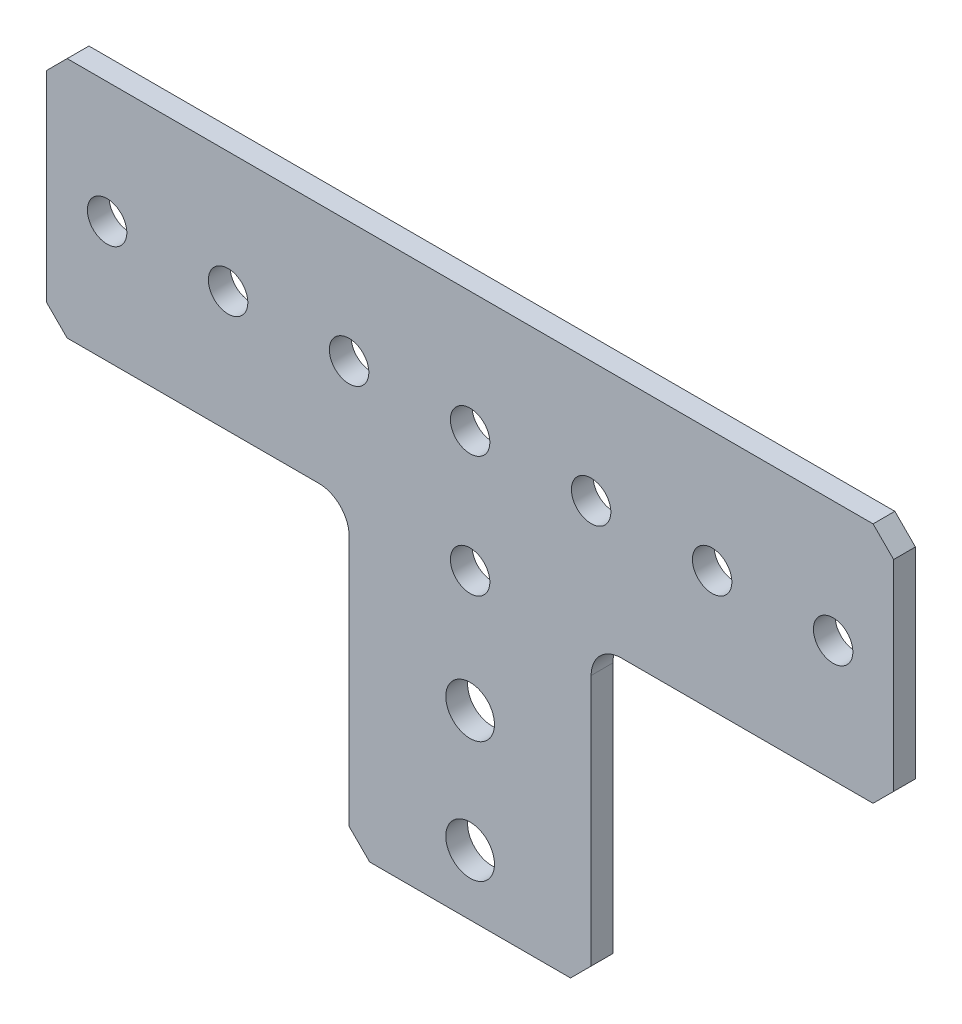
ISO-10303-21;
HEADER;
FILE_DESCRIPTION(('STEP AP214'),'2;1');
FILE_NAME('part.step','',(''),(''),'','','');
FILE_SCHEMA(('AUTOMOTIVE_DESIGN { 1 0 10303 214 1 1 1 1 }'));
ENDSEC;
DATA;
#1=APPLICATION_CONTEXT('core data for automotive mechanical design processes');
#2=APPLICATION_PROTOCOL_DEFINITION('international standard','automotive_design',2000,#1);
#3=PRODUCT_CONTEXT('',#1,'mechanical');
#4=PRODUCT('Part','Part','',(#3));
#5=PRODUCT_RELATED_PRODUCT_CATEGORY('part','',(#4));
#6=PRODUCT_DEFINITION_FORMATION('','',#4);
#7=PRODUCT_DEFINITION_CONTEXT('part definition',#1,'design');
#8=PRODUCT_DEFINITION('design','',#6,#7);
#9=PRODUCT_DEFINITION_SHAPE('','',#8);
#10=(LENGTH_UNIT() NAMED_UNIT(*) SI_UNIT(.MILLI.,.METRE.));
#11=(NAMED_UNIT(*) PLANE_ANGLE_UNIT() SI_UNIT($,.RADIAN.));
#12=(NAMED_UNIT(*) SI_UNIT($,.STERADIAN.) SOLID_ANGLE_UNIT());
#13=UNCERTAINTY_MEASURE_WITH_UNIT(LENGTH_MEASURE(1.E-05),#10,'distance_accuracy_value','');
#14=(GEOMETRIC_REPRESENTATION_CONTEXT(3) GLOBAL_UNCERTAINTY_ASSIGNED_CONTEXT((#13)) GLOBAL_UNIT_ASSIGNED_CONTEXT((#10,
#11,#12)) REPRESENTATION_CONTEXT('',''));
#15=CARTESIAN_POINT('',(0.,0.,0.));
#16=DIRECTION('',(0.,0.,1.));
#17=DIRECTION('',(1.,0.,0.));
#18=AXIS2_PLACEMENT_3D('',#15,#16,#17);
#19=CARTESIAN_POINT('',(-44.45,0.,0.));
#20=DIRECTION('',(0.,0.,1.));
#21=DIRECTION('',(1.,0.,0.));
#22=AXIS2_PLACEMENT_3D('',#19,#20,#21);
#23=PLANE('',#22);
#24=CARTESIAN_POINT('',(38.1,12.7,0.));
#25=DIRECTION('',(0.,0.,-1.));
#26=DIRECTION('',(-1.,0.,0.));
#27=AXIS2_PLACEMENT_3D('',#24,#25,#26);
#28=CIRCLE('',#27,2.0701);
#29=CARTESIAN_POINT('',(36.0299,12.7,0.));
#30=VERTEX_POINT('',#29);
#31=EDGE_CURVE('E281',#30,#30,#28,.F.);
#32=ORIENTED_EDGE('',*,*,#31,.T.);
#33=EDGE_LOOP('',(#32));
#34=FACE_BOUND('',#33,.T.);
#35=CARTESIAN_POINT('',(12.7,12.7,0.));
#36=DIRECTION('',(0.,0.,-1.));
#37=DIRECTION('',(-1.,0.,0.));
#38=AXIS2_PLACEMENT_3D('',#35,#36,#37);
#39=CIRCLE('',#38,2.0701);
#40=CARTESIAN_POINT('',(10.6299,12.7,0.));
#41=VERTEX_POINT('',#40);
#42=EDGE_CURVE('E284',#41,#41,#39,.F.);
#43=ORIENTED_EDGE('',*,*,#42,.T.);
#44=EDGE_LOOP('',(#43));
#45=FACE_BOUND('',#44,.T.);
#46=CARTESIAN_POINT('',(-12.7,12.7,0.));
#47=DIRECTION('',(0.,0.,-1.));
#48=DIRECTION('',(-1.,0.,0.));
#49=AXIS2_PLACEMENT_3D('',#46,#47,#48);
#50=CIRCLE('',#49,2.0701);
#51=CARTESIAN_POINT('',(-14.7701,12.7,0.));
#52=VERTEX_POINT('',#51);
#53=EDGE_CURVE('E287',#52,#52,#50,.F.);
#54=ORIENTED_EDGE('',*,*,#53,.T.);
#55=EDGE_LOOP('',(#54));
#56=FACE_BOUND('',#55,.T.);
#57=CARTESIAN_POINT('',(-25.4,12.7,0.));
#58=DIRECTION('',(0.,0.,-1.));
#59=DIRECTION('',(-1.,0.,0.));
#60=AXIS2_PLACEMENT_3D('',#57,#58,#59);
#61=CIRCLE('',#60,2.0701);
#62=CARTESIAN_POINT('',(-27.4701,12.7,0.));
#63=VERTEX_POINT('',#62);
#64=EDGE_CURVE('E290',#63,#63,#61,.F.);
#65=ORIENTED_EDGE('',*,*,#64,.T.);
#66=EDGE_LOOP('',(#65));
#67=FACE_BOUND('',#66,.T.);
#68=CARTESIAN_POINT('',(-38.1,12.7,0.));
#69=DIRECTION('',(0.,0.,-1.));
#70=DIRECTION('',(-1.,0.,0.));
#71=AXIS2_PLACEMENT_3D('',#68,#69,#70);
#72=CIRCLE('',#71,2.0701);
#73=CARTESIAN_POINT('',(-40.1701,12.7,0.));
#74=VERTEX_POINT('',#73);
#75=EDGE_CURVE('E293',#74,#74,#72,.F.);
#76=ORIENTED_EDGE('',*,*,#75,.T.);
#77=EDGE_LOOP('',(#76));
#78=FACE_BOUND('',#77,.T.);
#79=CARTESIAN_POINT('',(0.,12.7,0.));
#80=DIRECTION('',(0.,0.,-1.));
#81=DIRECTION('',(-1.,0.,0.));
#82=AXIS2_PLACEMENT_3D('',#79,#80,#81);
#83=CIRCLE('',#82,2.0701);
#84=CARTESIAN_POINT('',(-2.0701,12.7,0.));
#85=VERTEX_POINT('',#84);
#86=EDGE_CURVE('E296',#85,#85,#83,.F.);
#87=ORIENTED_EDGE('',*,*,#86,.T.);
#88=EDGE_LOOP('',(#87));
#89=FACE_BOUND('',#88,.T.);
#90=CARTESIAN_POINT('',(25.4,12.7,0.));
#91=DIRECTION('',(0.,0.,-1.));
#92=DIRECTION('',(-1.,0.,0.));
#93=AXIS2_PLACEMENT_3D('',#90,#91,#92);
#94=CIRCLE('',#93,2.0701);
#95=CARTESIAN_POINT('',(23.3299,12.7,0.));
#96=VERTEX_POINT('',#95);
#97=EDGE_CURVE('E299',#96,#96,#94,.F.);
#98=ORIENTED_EDGE('',*,*,#97,.T.);
#99=EDGE_LOOP('',(#98));
#100=FACE_BOUND('',#99,.T.);
#101=CARTESIAN_POINT('',(0.,0.,0.));
#102=DIRECTION('',(0.,0.,-1.));
#103=DIRECTION('',(-1.,0.,0.));
#104=AXIS2_PLACEMENT_3D('',#101,#102,#103);
#105=CIRCLE('',#104,2.0701);
#106=CARTESIAN_POINT('',(-2.0701,0.,0.));
#107=VERTEX_POINT('',#106);
#108=EDGE_CURVE('E302',#107,#107,#105,.F.);
#109=ORIENTED_EDGE('',*,*,#108,.T.);
#110=EDGE_LOOP('',(#109));
#111=FACE_BOUND('',#110,.T.);
#112=DIRECTION('',(-0.707106781186547,-0.707106781186548,0.));
#113=VECTOR('',#112,1.);
#114=CARTESIAN_POINT('',(12.7,-29.591,0.));
#115=LINE('',#114,#113);
#116=CARTESIAN_POINT('',(12.7,-29.591,0.));
#117=VERTEX_POINT('',#116);
#118=CARTESIAN_POINT('',(10.541,-31.75,0.));
#119=VERTEX_POINT('',#118);
#120=EDGE_CURVE('E168',#117,#119,#115,.T.);
#121=ORIENTED_EDGE('',*,*,#120,.T.);
#122=DIRECTION('',(1.,0.,0.));
#123=VECTOR('',#122,1.);
#124=CARTESIAN_POINT('',(-12.7,-31.75,0.));
#125=LINE('',#124,#123);
#126=CARTESIAN_POINT('',(-10.541,-31.75,0.));
#127=VERTEX_POINT('',#126);
#128=EDGE_CURVE('E191',#119,#127,#125,.F.);
#129=ORIENTED_EDGE('',*,*,#128,.T.);
#130=DIRECTION('',(-0.707106781186547,0.707106781186548,0.));
#131=VECTOR('',#130,1.);
#132=CARTESIAN_POINT('',(-10.541,-31.75,0.));
#133=LINE('',#132,#131);
#134=CARTESIAN_POINT('',(-12.7,-29.591,0.));
#135=VERTEX_POINT('',#134);
#136=EDGE_CURVE('E179',#127,#135,#133,.T.);
#137=ORIENTED_EDGE('',*,*,#136,.T.);
#138=DIRECTION('',(0.,1.,0.));
#139=VECTOR('',#138,1.);
#140=CARTESIAN_POINT('',(-12.7,0.,0.));
#141=LINE('',#140,#139);
#142=CARTESIAN_POINT('',(-12.7,-3.175,0.));
#143=VERTEX_POINT('',#142);
#144=EDGE_CURVE('E183',#135,#143,#141,.T.);
#145=ORIENTED_EDGE('',*,*,#144,.T.);
#146=CARTESIAN_POINT('',(-15.875,-3.175,0.));
#147=DIRECTION('',(0.,0.,1.));
#148=DIRECTION('',(1.,0.,0.));
#149=AXIS2_PLACEMENT_3D('',#146,#147,#148);
#150=CIRCLE('',#149,3.175);
#151=CARTESIAN_POINT('',(-15.875,0.,0.));
#152=VERTEX_POINT('',#151);
#153=EDGE_CURVE('E199',#143,#152,#150,.T.);
#154=ORIENTED_EDGE('',*,*,#153,.T.);
#155=DIRECTION('',(1.,0.,0.));
#156=VECTOR('',#155,1.);
#157=CARTESIAN_POINT('',(-44.45,0.,0.));
#158=LINE('',#157,#156);
#159=CARTESIAN_POINT('',(-42.291,0.,0.));
#160=VERTEX_POINT('',#159);
#161=EDGE_CURVE('E196',#152,#160,#158,.F.);
#162=ORIENTED_EDGE('',*,*,#161,.T.);
#163=DIRECTION('',(-0.707106781186548,0.707106781186548,0.));
#164=VECTOR('',#163,1.);
#165=CARTESIAN_POINT('',(-42.291,0.,0.));
#166=LINE('',#165,#164);
#167=CARTESIAN_POINT('',(-44.45,2.159,0.));
#168=VERTEX_POINT('',#167);
#169=EDGE_CURVE('E203',#160,#168,#166,.T.);
#170=ORIENTED_EDGE('',*,*,#169,.T.);
#171=DIRECTION('',(0.,1.,0.));
#172=VECTOR('',#171,1.);
#173=CARTESIAN_POINT('',(-44.45,25.4,0.));
#174=LINE('',#173,#172);
#175=CARTESIAN_POINT('',(-44.45,23.241,0.));
#176=VERTEX_POINT('',#175);
#177=EDGE_CURVE('E206',#168,#176,#174,.T.);
#178=ORIENTED_EDGE('',*,*,#177,.T.);
#179=DIRECTION('',(0.707106781186548,0.707106781186548,0.));
#180=VECTOR('',#179,1.);
#181=CARTESIAN_POINT('',(-44.45,23.241,0.));
#182=LINE('',#181,#180);
#183=CARTESIAN_POINT('',(-42.291,25.4,0.));
#184=VERTEX_POINT('',#183);
#185=EDGE_CURVE('E214',#176,#184,#182,.T.);
#186=ORIENTED_EDGE('',*,*,#185,.T.);
#187=DIRECTION('',(1.,0.,0.));
#188=VECTOR('',#187,1.);
#189=CARTESIAN_POINT('',(-44.45,25.4,0.));
#190=LINE('',#189,#188);
#191=CARTESIAN_POINT('',(42.291,25.4,0.));
#192=VERTEX_POINT('',#191);
#193=EDGE_CURVE('E217',#184,#192,#190,.T.);
#194=ORIENTED_EDGE('',*,*,#193,.T.);
#195=DIRECTION('',(0.707106781186546,-0.707106781186549,0.));
#196=VECTOR('',#195,1.);
#197=CARTESIAN_POINT('',(42.291,25.4,0.));
#198=LINE('',#197,#196);
#199=CARTESIAN_POINT('',(44.45,23.241,0.));
#200=VERTEX_POINT('',#199);
#201=EDGE_CURVE('E225',#192,#200,#198,.T.);
#202=ORIENTED_EDGE('',*,*,#201,.T.);
#203=DIRECTION('',(0.,1.,0.));
#204=VECTOR('',#203,1.);
#205=CARTESIAN_POINT('',(44.45,25.4,0.));
#206=LINE('',#205,#204);
#207=CARTESIAN_POINT('',(44.45,2.15900000000001,0.));
#208=VERTEX_POINT('',#207);
#209=EDGE_CURVE('E228',#200,#208,#206,.F.);
#210=ORIENTED_EDGE('',*,*,#209,.T.);
#211=DIRECTION('',(-0.707106781186548,-0.707106781186548,0.));
#212=VECTOR('',#211,1.);
#213=CARTESIAN_POINT('',(44.45,2.159,0.));
#214=LINE('',#213,#212);
#215=CARTESIAN_POINT('',(42.291,0.,0.));
#216=VERTEX_POINT('',#215);
#217=EDGE_CURVE('E236',#208,#216,#214,.T.);
#218=ORIENTED_EDGE('',*,*,#217,.T.);
#219=DIRECTION('',(1.,0.,0.));
#220=VECTOR('',#219,1.);
#221=CARTESIAN_POINT('',(44.45,0.,0.));
#222=LINE('',#221,#220);
#223=CARTESIAN_POINT('',(15.875,0.,0.));
#224=VERTEX_POINT('',#223);
#225=EDGE_CURVE('E127',#216,#224,#222,.F.);
#226=ORIENTED_EDGE('',*,*,#225,.T.);
#227=CARTESIAN_POINT('',(15.875,-3.175,0.));
#228=DIRECTION('',(0.,0.,1.));
#229=DIRECTION('',(1.,0.,0.));
#230=AXIS2_PLACEMENT_3D('',#227,#228,#229);
#231=CIRCLE('',#230,3.175);
#232=CARTESIAN_POINT('',(12.7,-3.175,0.));
#233=VERTEX_POINT('',#232);
#234=EDGE_CURVE('E130',#224,#233,#231,.T.);
#235=ORIENTED_EDGE('',*,*,#234,.T.);
#236=DIRECTION('',(0.,-1.,0.));
#237=VECTOR('',#236,1.);
#238=CARTESIAN_POINT('',(12.7,0.,0.));
#239=LINE('',#238,#237);
#240=EDGE_CURVE('E133',#233,#117,#239,.T.);
#241=ORIENTED_EDGE('',*,*,#240,.T.);
#242=EDGE_LOOP('',(#121,#129,#137,#145,#154,#162,#170,#178,#186,#194,#202,#210,#218,#226,#235,#241));
#243=FACE_BOUND('',#242,.T.);
#244=CARTESIAN_POINT('',(0.,-25.4,0.));
#245=DIRECTION('',(0.,0.,1.));
#246=DIRECTION('',(1.,0.,0.));
#247=AXIS2_PLACEMENT_3D('',#244,#245,#246);
#248=CIRCLE('',#247,2.5527);
#249=CARTESIAN_POINT('',(2.5527,-25.4,0.));
#250=VERTEX_POINT('',#249);
#251=EDGE_CURVE('E193',#250,#250,#248,.T.);
#252=ORIENTED_EDGE('',*,*,#251,.T.);
#253=EDGE_LOOP('',(#252));
#254=FACE_BOUND('',#253,.T.);
#255=CARTESIAN_POINT('',(0.,-12.7,0.));
#256=DIRECTION('',(0.,0.,1.));
#257=DIRECTION('',(1.,0.,0.));
#258=AXIS2_PLACEMENT_3D('',#255,#256,#257);
#259=CIRCLE('',#258,2.5527);
#260=CARTESIAN_POINT('',(2.5527,-12.7,0.));
#261=VERTEX_POINT('',#260);
#262=EDGE_CURVE('E19',#261,#261,#259,.T.);
#263=ORIENTED_EDGE('',*,*,#262,.T.);
#264=EDGE_LOOP('',(#263));
#265=FACE_BOUND('',#264,.T.);
#266=ADVANCED_FACE('F16',(#34,#45,#56,#67,#78,#89,#100,#111,#243,#254,#265),#23,.F.);
#267=CARTESIAN_POINT('',(0.,-12.7,0.));
#268=DIRECTION('',(0.,0.,1.));
#269=DIRECTION('',(1.,0.,0.));
#270=AXIS2_PLACEMENT_3D('',#267,#268,#269);
#271=CYLINDRICAL_SURFACE('',#270,2.5527);
#272=CARTESIAN_POINT('',(0.,-12.7,2.286));
#273=DIRECTION('',(0.,0.,1.));
#274=DIRECTION('',(1.,0.,0.));
#275=AXIS2_PLACEMENT_3D('',#272,#273,#274);
#276=CIRCLE('',#275,2.5527);
#277=CARTESIAN_POINT('',(2.5527,-12.7,2.286));
#278=VERTEX_POINT('',#277);
#279=EDGE_CURVE('E278',#278,#278,#276,.F.);
#280=ORIENTED_EDGE('',*,*,#279,.F.);
#281=EDGE_LOOP('',(#280));
#282=FACE_BOUND('',#281,.T.);
#283=ORIENTED_EDGE('',*,*,#262,.F.);
#284=EDGE_LOOP('',(#283));
#285=FACE_BOUND('',#284,.T.);
#286=ADVANCED_FACE('F311',(#282,#285),#271,.F.);
#287=CARTESIAN_POINT('',(0.,-25.4,0.));
#288=DIRECTION('',(0.,0.,1.));
#289=DIRECTION('',(1.,0.,0.));
#290=AXIS2_PLACEMENT_3D('',#287,#288,#289);
#291=CYLINDRICAL_SURFACE('',#290,2.5527);
#292=CARTESIAN_POINT('',(0.,-25.4,2.286));
#293=DIRECTION('',(0.,0.,1.));
#294=DIRECTION('',(1.,0.,0.));
#295=AXIS2_PLACEMENT_3D('',#292,#293,#294);
#296=CIRCLE('',#295,2.5527);
#297=CARTESIAN_POINT('',(2.5527,-25.4,2.286));
#298=VERTEX_POINT('',#297);
#299=EDGE_CURVE('E173',#298,#298,#296,.F.);
#300=ORIENTED_EDGE('',*,*,#299,.F.);
#301=EDGE_LOOP('',(#300));
#302=FACE_BOUND('',#301,.T.);
#303=ORIENTED_EDGE('',*,*,#251,.F.);
#304=EDGE_LOOP('',(#303));
#305=FACE_BOUND('',#304,.T.);
#306=ADVANCED_FACE('F313',(#302,#305),#291,.F.);
#307=CARTESIAN_POINT('',(-12.7,-31.75,2.286));
#308=DIRECTION('',(0.,1.,0.));
#309=DIRECTION('',(0.,0.,1.));
#310=AXIS2_PLACEMENT_3D('',#307,#308,#309);
#311=PLANE('',#310);
#312=DIRECTION('',(0.,0.,1.));
#313=VECTOR('',#312,1.);
#314=CARTESIAN_POINT('',(10.541,-31.75,2.286));
#315=LINE('',#314,#313);
#316=CARTESIAN_POINT('',(10.541,-31.75,2.286));
#317=VERTEX_POINT('',#316);
#318=EDGE_CURVE('E157',#119,#317,#315,.T.);
#319=ORIENTED_EDGE('',*,*,#318,.T.);
#320=DIRECTION('',(1.,0.,0.));
#321=VECTOR('',#320,1.);
#322=CARTESIAN_POINT('',(-44.45,-31.75,2.286));
#323=LINE('',#322,#321);
#324=CARTESIAN_POINT('',(-10.541,-31.75,2.286));
#325=VERTEX_POINT('',#324);
#326=EDGE_CURVE('E164',#325,#317,#323,.T.);
#327=ORIENTED_EDGE('',*,*,#326,.F.);
#328=DIRECTION('',(0.,0.,1.));
#329=VECTOR('',#328,1.);
#330=CARTESIAN_POINT('',(-10.541,-31.75,2.286));
#331=LINE('',#330,#329);
#332=EDGE_CURVE('E176',#325,#127,#331,.F.);
#333=ORIENTED_EDGE('',*,*,#332,.T.);
#334=ORIENTED_EDGE('',*,*,#128,.F.);
#335=EDGE_LOOP('',(#319,#327,#333,#334));
#336=FACE_BOUND('',#335,.T.);
#337=ADVANCED_FACE('F320',(#336),#311,.F.);
#338=CARTESIAN_POINT('',(12.7,-29.591,2.286));
#339=DIRECTION('',(-0.707106781186548,0.707106781186547,0.));
#340=DIRECTION('',(-0.707106781186547,-0.707106781186548,0.));
#341=AXIS2_PLACEMENT_3D('',#338,#339,#340);
#342=PLANE('',#341);
#343=ORIENTED_EDGE('',*,*,#318,.F.);
#344=ORIENTED_EDGE('',*,*,#120,.F.);
#345=DIRECTION('',(0.,0.,1.));
#346=VECTOR('',#345,1.);
#347=CARTESIAN_POINT('',(12.7,-29.591,2.286));
#348=LINE('',#347,#346);
#349=CARTESIAN_POINT('',(12.7,-29.591,2.286));
#350=VERTEX_POINT('',#349);
#351=EDGE_CURVE('E144',#117,#350,#348,.T.);
#352=ORIENTED_EDGE('',*,*,#351,.T.);
#353=DIRECTION('',(0.707106781186547,0.707106781186547,0.));
#354=VECTOR('',#353,1.);
#355=CARTESIAN_POINT('',(10.541,-31.75,2.286));
#356=LINE('',#355,#354);
#357=EDGE_CURVE('E160',#317,#350,#356,.T.);
#358=ORIENTED_EDGE('',*,*,#357,.F.);
#359=EDGE_LOOP('',(#343,#344,#352,#358));
#360=FACE_BOUND('',#359,.T.);
#361=ADVANCED_FACE('F417',(#360),#342,.F.);
#362=CARTESIAN_POINT('',(12.7,0.,2.286));
#363=DIRECTION('',(-1.,0.,0.));
#364=DIRECTION('',(0.,-1.,0.));
#365=AXIS2_PLACEMENT_3D('',#362,#363,#364);
#366=PLANE('',#365);
#367=DIRECTION('',(0.,0.,1.));
#368=VECTOR('',#367,1.);
#369=CARTESIAN_POINT('',(12.7,-3.175,2.286));
#370=LINE('',#369,#368);
#371=CARTESIAN_POINT('',(12.7,-3.175,2.286));
#372=VERTEX_POINT('',#371);
#373=EDGE_CURVE('E138',#233,#372,#370,.T.);
#374=ORIENTED_EDGE('',*,*,#373,.T.);
#375=DIRECTION('',(0.,1.,0.));
#376=VECTOR('',#375,1.);
#377=CARTESIAN_POINT('',(12.7,0.,2.286));
#378=LINE('',#377,#376);
#379=EDGE_CURVE('E163',#350,#372,#378,.T.);
#380=ORIENTED_EDGE('',*,*,#379,.F.);
#381=ORIENTED_EDGE('',*,*,#351,.F.);
#382=ORIENTED_EDGE('',*,*,#240,.F.);
#383=EDGE_LOOP('',(#374,#380,#381,#382));
#384=FACE_BOUND('',#383,.T.);
#385=ADVANCED_FACE('F141',(#384),#366,.F.);
#386=CARTESIAN_POINT('',(15.875,-3.175,2.286));
#387=DIRECTION('',(0.,0.,1.));
#388=DIRECTION('',(1.,0.,0.));
#389=AXIS2_PLACEMENT_3D('',#386,#387,#388);
#390=CYLINDRICAL_SURFACE('',#389,3.175);
#391=ORIENTED_EDGE('',*,*,#373,.F.);
#392=ORIENTED_EDGE('',*,*,#234,.F.);
#393=DIRECTION('',(0.,0.,1.));
#394=VECTOR('',#393,1.);
#395=CARTESIAN_POINT('',(15.875,0.,2.286));
#396=LINE('',#395,#394);
#397=CARTESIAN_POINT('',(15.875,0.,2.286));
#398=VERTEX_POINT('',#397);
#399=EDGE_CURVE('E151',#224,#398,#396,.T.);
#400=ORIENTED_EDGE('',*,*,#399,.T.);
#401=CARTESIAN_POINT('',(15.875,-3.175,2.286));
#402=DIRECTION('',(0.,0.,1.));
#403=DIRECTION('',(1.,0.,0.));
#404=AXIS2_PLACEMENT_3D('',#401,#402,#403);
#405=CIRCLE('',#404,3.175);
#406=EDGE_CURVE('E148',#372,#398,#405,.F.);
#407=ORIENTED_EDGE('',*,*,#406,.F.);
#408=EDGE_LOOP('',(#391,#392,#400,#407));
#409=FACE_BOUND('',#408,.T.);
#410=ADVANCED_FACE('F146',(#409),#390,.F.);
#411=CARTESIAN_POINT('',(44.45,0.,2.286));
#412=DIRECTION('',(0.,1.,0.));
#413=DIRECTION('',(0.,0.,1.));
#414=AXIS2_PLACEMENT_3D('',#411,#412,#413);
#415=PLANE('',#414);
#416=ORIENTED_EDGE('',*,*,#399,.F.);
#417=ORIENTED_EDGE('',*,*,#225,.F.);
#418=DIRECTION('',(0.,0.,1.));
#419=VECTOR('',#418,1.);
#420=CARTESIAN_POINT('',(42.291,0.,2.286));
#421=LINE('',#420,#419);
#422=CARTESIAN_POINT('',(42.291,0.,2.286));
#423=VERTEX_POINT('',#422);
#424=EDGE_CURVE('E238',#216,#423,#421,.T.);
#425=ORIENTED_EDGE('',*,*,#424,.T.);
#426=DIRECTION('',(1.,0.,0.));
#427=VECTOR('',#426,1.);
#428=CARTESIAN_POINT('',(-44.45,0.,2.286));
#429=LINE('',#428,#427);
#430=EDGE_CURVE('E275',#398,#423,#429,.T.);
#431=ORIENTED_EDGE('',*,*,#430,.F.);
#432=EDGE_LOOP('',(#416,#417,#425,#431));
#433=FACE_BOUND('',#432,.T.);
#434=ADVANCED_FACE('F408',(#433),#415,.F.);
#435=CARTESIAN_POINT('',(44.45,2.159,2.286));
#436=DIRECTION('',(-0.707106781186548,0.707106781186548,0.));
#437=DIRECTION('',(-0.707106781186548,-0.707106781186548,0.));
#438=AXIS2_PLACEMENT_3D('',#435,#436,#437);
#439=PLANE('',#438);
#440=ORIENTED_EDGE('',*,*,#424,.F.);
#441=ORIENTED_EDGE('',*,*,#217,.F.);
#442=DIRECTION('',(0.,0.,1.));
#443=VECTOR('',#442,1.);
#444=CARTESIAN_POINT('',(44.45,2.159,2.286));
#445=LINE('',#444,#443);
#446=CARTESIAN_POINT('',(44.45,2.15900000000003,2.286));
#447=VERTEX_POINT('',#446);
#448=EDGE_CURVE('E233',#208,#447,#445,.T.);
#449=ORIENTED_EDGE('',*,*,#448,.T.);
#450=DIRECTION('',(0.707106781186541,0.707106781186554,0.));
#451=VECTOR('',#450,1.);
#452=CARTESIAN_POINT('',(42.291,0.,2.286));
#453=LINE('',#452,#451);
#454=EDGE_CURVE('E490',#423,#447,#453,.T.);
#455=ORIENTED_EDGE('',*,*,#454,.F.);
#456=EDGE_LOOP('',(#440,#441,#449,#455));
#457=FACE_BOUND('',#456,.T.);
#458=ADVANCED_FACE('F404',(#457),#439,.F.);
#459=CARTESIAN_POINT('',(44.45,25.4,2.286));
#460=DIRECTION('',(-1.,0.,0.));
#461=DIRECTION('',(0.,0.,1.));
#462=AXIS2_PLACEMENT_3D('',#459,#460,#461);
#463=PLANE('',#462);
#464=DIRECTION('',(0.,0.,1.));
#465=VECTOR('',#464,1.);
#466=CARTESIAN_POINT('',(44.45,23.241,2.286));
#467=LINE('',#466,#465);
#468=CARTESIAN_POINT('',(44.45,23.241,2.286));
#469=VERTEX_POINT('',#468);
#470=EDGE_CURVE('E227',#200,#469,#467,.T.);
#471=ORIENTED_EDGE('',*,*,#470,.T.);
#472=DIRECTION('',(0.,1.,0.));
#473=VECTOR('',#472,1.);
#474=CARTESIAN_POINT('',(44.45,0.,2.286));
#475=LINE('',#474,#473);
#476=EDGE_CURVE('E482',#447,#469,#475,.T.);
#477=ORIENTED_EDGE('',*,*,#476,.F.);
#478=ORIENTED_EDGE('',*,*,#448,.F.);
#479=ORIENTED_EDGE('',*,*,#209,.F.);
#480=EDGE_LOOP('',(#471,#477,#478,#479));
#481=FACE_BOUND('',#480,.T.);
#482=ADVANCED_FACE('F400',(#481),#463,.F.);
#483=CARTESIAN_POINT('',(42.291,25.4,2.286));
#484=DIRECTION('',(-0.707106781186549,-0.707106781186546,0.));
#485=DIRECTION('',(0.707106781186546,-0.707106781186549,0.));
#486=AXIS2_PLACEMENT_3D('',#483,#484,#485);
#487=PLANE('',#486);
#488=ORIENTED_EDGE('',*,*,#470,.F.);
#489=ORIENTED_EDGE('',*,*,#201,.F.);
#490=DIRECTION('',(0.,0.,-1.));
#491=VECTOR('',#490,1.);
#492=CARTESIAN_POINT('',(42.291,25.4,2.286));
#493=LINE('',#492,#491);
#494=CARTESIAN_POINT('',(42.291,25.4,2.286));
#495=VERTEX_POINT('',#494);
#496=EDGE_CURVE('E222',#192,#495,#493,.F.);
#497=ORIENTED_EDGE('',*,*,#496,.T.);
#498=DIRECTION('',(-0.707106781186547,0.707106781186548,0.));
#499=VECTOR('',#498,1.);
#500=CARTESIAN_POINT('',(44.45,23.241,2.286));
#501=LINE('',#500,#499);
#502=EDGE_CURVE('E474',#469,#495,#501,.T.);
#503=ORIENTED_EDGE('',*,*,#502,.F.);
#504=EDGE_LOOP('',(#488,#489,#497,#503));
#505=FACE_BOUND('',#504,.T.);
#506=ADVANCED_FACE('F396',(#505),#487,.F.);
#507=CARTESIAN_POINT('',(-44.45,25.4,2.286));
#508=DIRECTION('',(0.,-1.,0.));
#509=DIRECTION('',(0.,0.,-1.));
#510=AXIS2_PLACEMENT_3D('',#507,#508,#509);
#511=PLANE('',#510);
#512=DIRECTION('',(0.,0.,1.));
#513=VECTOR('',#512,1.);
#514=CARTESIAN_POINT('',(-42.291,25.4,2.286));
#515=LINE('',#514,#513);
#516=CARTESIAN_POINT('',(-42.291,25.4,2.286));
#517=VERTEX_POINT('',#516);
#518=EDGE_CURVE('E216',#184,#517,#515,.T.);
#519=ORIENTED_EDGE('',*,*,#518,.T.);
#520=DIRECTION('',(1.,0.,0.));
#521=VECTOR('',#520,1.);
#522=CARTESIAN_POINT('',(-44.45,25.4,2.286));
#523=LINE('',#522,#521);
#524=EDGE_CURVE('E466',#495,#517,#523,.F.);
#525=ORIENTED_EDGE('',*,*,#524,.F.);
#526=ORIENTED_EDGE('',*,*,#496,.F.);
#527=ORIENTED_EDGE('',*,*,#193,.F.);
#528=EDGE_LOOP('',(#519,#525,#526,#527));
#529=FACE_BOUND('',#528,.T.);
#530=ADVANCED_FACE('F392',(#529),#511,.F.);
#531=CARTESIAN_POINT('',(-44.45,23.241,2.286));
#532=DIRECTION('',(0.707106781186548,-0.707106781186548,0.));
#533=DIRECTION('',(0.707106781186548,0.707106781186548,0.));
#534=AXIS2_PLACEMENT_3D('',#531,#532,#533);
#535=PLANE('',#534);
#536=ORIENTED_EDGE('',*,*,#518,.F.);
#537=ORIENTED_EDGE('',*,*,#185,.F.);
#538=DIRECTION('',(0.,0.,-1.));
#539=VECTOR('',#538,1.);
#540=CARTESIAN_POINT('',(-44.45,23.241,2.286));
#541=LINE('',#540,#539);
#542=CARTESIAN_POINT('',(-44.45,23.241,2.286));
#543=VERTEX_POINT('',#542);
#544=EDGE_CURVE('E211',#176,#543,#541,.F.);
#545=ORIENTED_EDGE('',*,*,#544,.T.);
#546=DIRECTION('',(-0.707106781186548,-0.707106781186547,0.));
#547=VECTOR('',#546,1.);
#548=CARTESIAN_POINT('',(-42.291,25.4,2.286));
#549=LINE('',#548,#547);
#550=EDGE_CURVE('E458',#517,#543,#549,.T.);
#551=ORIENTED_EDGE('',*,*,#550,.F.);
#552=EDGE_LOOP('',(#536,#537,#545,#551));
#553=FACE_BOUND('',#552,.T.);
#554=ADVANCED_FACE('F388',(#553),#535,.F.);
#555=CARTESIAN_POINT('',(-44.45,25.4,2.286));
#556=DIRECTION('',(1.,0.,0.));
#557=DIRECTION('',(0.,0.,-1.));
#558=AXIS2_PLACEMENT_3D('',#555,#556,#557);
#559=PLANE('',#558);
#560=DIRECTION('',(0.,0.,1.));
#561=VECTOR('',#560,1.);
#562=CARTESIAN_POINT('',(-44.45,2.159,2.286));
#563=LINE('',#562,#561);
#564=CARTESIAN_POINT('',(-44.45,2.159,2.286));
#565=VERTEX_POINT('',#564);
#566=EDGE_CURVE('E205',#168,#565,#563,.T.);
#567=ORIENTED_EDGE('',*,*,#566,.T.);
#568=DIRECTION('',(0.,1.,0.));
#569=VECTOR('',#568,1.);
#570=CARTESIAN_POINT('',(-44.45,0.,2.286));
#571=LINE('',#570,#569);
#572=EDGE_CURVE('E450',#543,#565,#571,.F.);
#573=ORIENTED_EDGE('',*,*,#572,.F.);
#574=ORIENTED_EDGE('',*,*,#544,.F.);
#575=ORIENTED_EDGE('',*,*,#177,.F.);
#576=EDGE_LOOP('',(#567,#573,#574,#575));
#577=FACE_BOUND('',#576,.T.);
#578=ADVANCED_FACE('F384',(#577),#559,.F.);
#579=CARTESIAN_POINT('',(-42.291,0.,2.286));
#580=DIRECTION('',(0.707106781186548,0.707106781186548,0.));
#581=DIRECTION('',(-0.707106781186548,0.707106781186548,0.));
#582=AXIS2_PLACEMENT_3D('',#579,#580,#581);
#583=PLANE('',#582);
#584=ORIENTED_EDGE('',*,*,#566,.F.);
#585=ORIENTED_EDGE('',*,*,#169,.F.);
#586=DIRECTION('',(0.,0.,1.));
#587=VECTOR('',#586,1.);
#588=CARTESIAN_POINT('',(-42.291,0.,2.286));
#589=LINE('',#588,#587);
#590=CARTESIAN_POINT('',(-42.291,0.,2.286));
#591=VERTEX_POINT('',#590);
#592=EDGE_CURVE('E200',#160,#591,#589,.T.);
#593=ORIENTED_EDGE('',*,*,#592,.T.);
#594=DIRECTION('',(0.707106781186548,-0.707106781186547,0.));
#595=VECTOR('',#594,1.);
#596=CARTESIAN_POINT('',(-44.45,2.159,2.286));
#597=LINE('',#596,#595);
#598=EDGE_CURVE('E447',#565,#591,#597,.T.);
#599=ORIENTED_EDGE('',*,*,#598,.F.);
#600=EDGE_LOOP('',(#584,#585,#593,#599));
#601=FACE_BOUND('',#600,.T.);
#602=ADVANCED_FACE('F380',(#601),#583,.F.);
#603=CARTESIAN_POINT('',(-44.45,0.,2.286));
#604=DIRECTION('',(0.,1.,0.));
#605=DIRECTION('',(0.,0.,1.));
#606=AXIS2_PLACEMENT_3D('',#603,#604,#605);
#607=PLANE('',#606);
#608=DIRECTION('',(0.,0.,1.));
#609=VECTOR('',#608,1.);
#610=CARTESIAN_POINT('',(-15.875,0.,2.286));
#611=LINE('',#610,#609);
#612=CARTESIAN_POINT('',(-15.875,0.,2.286));
#613=VERTEX_POINT('',#612);
#614=EDGE_CURVE('E185',#152,#613,#611,.T.);
#615=ORIENTED_EDGE('',*,*,#614,.T.);
#616=DIRECTION('',(1.,0.,0.));
#617=VECTOR('',#616,1.);
#618=CARTESIAN_POINT('',(-44.45,0.,2.286));
#619=LINE('',#618,#617);
#620=EDGE_CURVE('E273',#591,#613,#619,.T.);
#621=ORIENTED_EDGE('',*,*,#620,.F.);
#622=ORIENTED_EDGE('',*,*,#592,.F.);
#623=ORIENTED_EDGE('',*,*,#161,.F.);
#624=EDGE_LOOP('',(#615,#621,#622,#623));
#625=FACE_BOUND('',#624,.T.);
#626=ADVANCED_FACE('F376',(#625),#607,.F.);
#627=CARTESIAN_POINT('',(-15.875,-3.175,2.286));
#628=DIRECTION('',(0.,0.,1.));
#629=DIRECTION('',(1.,0.,0.));
#630=AXIS2_PLACEMENT_3D('',#627,#628,#629);
#631=CYLINDRICAL_SURFACE('',#630,3.175);
#632=ORIENTED_EDGE('',*,*,#614,.F.);
#633=ORIENTED_EDGE('',*,*,#153,.F.);
#634=DIRECTION('',(0.,0.,-1.));
#635=VECTOR('',#634,1.);
#636=CARTESIAN_POINT('',(-12.7,-3.175,2.286));
#637=LINE('',#636,#635);
#638=CARTESIAN_POINT('',(-12.7,-3.175,2.286));
#639=VERTEX_POINT('',#638);
#640=EDGE_CURVE('E180',#143,#639,#637,.F.);
#641=ORIENTED_EDGE('',*,*,#640,.T.);
#642=CARTESIAN_POINT('',(-15.875,-3.175,2.286));
#643=DIRECTION('',(0.,0.,1.));
#644=DIRECTION('',(1.,0.,0.));
#645=AXIS2_PLACEMENT_3D('',#642,#643,#644);
#646=CIRCLE('',#645,3.175);
#647=EDGE_CURVE('E269',#613,#639,#646,.F.);
#648=ORIENTED_EDGE('',*,*,#647,.F.);
#649=EDGE_LOOP('',(#632,#633,#641,#648));
#650=FACE_BOUND('',#649,.T.);
#651=ADVANCED_FACE('F373',(#650),#631,.F.);
#652=CARTESIAN_POINT('',(-12.7,0.,2.286));
#653=DIRECTION('',(1.,0.,0.));
#654=DIRECTION('',(0.,0.,-1.));
#655=AXIS2_PLACEMENT_3D('',#652,#653,#654);
#656=PLANE('',#655);
#657=ORIENTED_EDGE('',*,*,#640,.F.);
#658=ORIENTED_EDGE('',*,*,#144,.F.);
#659=DIRECTION('',(0.,0.,1.));
#660=VECTOR('',#659,1.);
#661=CARTESIAN_POINT('',(-12.7,-29.591,2.286));
#662=LINE('',#661,#660);
#663=CARTESIAN_POINT('',(-12.7,-29.591,2.286));
#664=VERTEX_POINT('',#663);
#665=EDGE_CURVE('E34',#135,#664,#662,.T.);
#666=ORIENTED_EDGE('',*,*,#665,.T.);
#667=DIRECTION('',(0.,1.,0.));
#668=VECTOR('',#667,1.);
#669=CARTESIAN_POINT('',(-12.7,0.,2.286));
#670=LINE('',#669,#668);
#671=EDGE_CURVE('E272',#639,#664,#670,.F.);
#672=ORIENTED_EDGE('',*,*,#671,.F.);
#673=EDGE_LOOP('',(#657,#658,#666,#672));
#674=FACE_BOUND('',#673,.T.);
#675=ADVANCED_FACE('F369',(#674),#656,.F.);
#676=CARTESIAN_POINT('',(-10.541,-31.75,2.286));
#677=DIRECTION('',(0.707106781186548,0.707106781186547,0.));
#678=DIRECTION('',(-0.707106781186547,0.707106781186548,0.));
#679=AXIS2_PLACEMENT_3D('',#676,#677,#678);
#680=PLANE('',#679);
#681=ORIENTED_EDGE('',*,*,#665,.F.);
#682=ORIENTED_EDGE('',*,*,#136,.F.);
#683=ORIENTED_EDGE('',*,*,#332,.F.);
#684=DIRECTION('',(0.707106781186547,-0.707106781186547,0.));
#685=VECTOR('',#684,1.);
#686=CARTESIAN_POINT('',(-12.7,-29.591,2.286));
#687=LINE('',#686,#685);
#688=EDGE_CURVE('E268',#664,#325,#687,.T.);
#689=ORIENTED_EDGE('',*,*,#688,.F.);
#690=EDGE_LOOP('',(#681,#682,#683,#689));
#691=FACE_BOUND('',#690,.T.);
#692=ADVANCED_FACE('F365',(#691),#680,.F.);
#693=CARTESIAN_POINT('',(0.,0.,2.286));
#694=DIRECTION('',(0.,0.,-1.));
#695=DIRECTION('',(-1.,0.,0.));
#696=AXIS2_PLACEMENT_3D('',#693,#694,#695);
#697=CYLINDRICAL_SURFACE('',#696,2.0701);
#698=CARTESIAN_POINT('',(0.,0.,2.286));
#699=DIRECTION('',(0.,0.,-1.));
#700=DIRECTION('',(-1.,0.,0.));
#701=AXIS2_PLACEMENT_3D('',#698,#699,#700);
#702=CIRCLE('',#701,2.0701);
#703=CARTESIAN_POINT('',(-2.0701,0.,2.286));
#704=VERTEX_POINT('',#703);
#705=EDGE_CURVE('E265',#704,#704,#702,.T.);
#706=ORIENTED_EDGE('',*,*,#705,.F.);
#707=EDGE_LOOP('',(#706));
#708=FACE_BOUND('',#707,.T.);
#709=ORIENTED_EDGE('',*,*,#108,.F.);
#710=EDGE_LOOP('',(#709));
#711=FACE_BOUND('',#710,.T.);
#712=ADVANCED_FACE('F361',(#708,#711),#697,.F.);
#713=CARTESIAN_POINT('',(25.4,12.7,2.286));
#714=DIRECTION('',(0.,0.,-1.));
#715=DIRECTION('',(-1.,0.,0.));
#716=AXIS2_PLACEMENT_3D('',#713,#714,#715);
#717=CYLINDRICAL_SURFACE('',#716,2.0701);
#718=CARTESIAN_POINT('',(25.4,12.7,2.286));
#719=DIRECTION('',(0.,0.,-1.));
#720=DIRECTION('',(-1.,0.,0.));
#721=AXIS2_PLACEMENT_3D('',#718,#719,#720);
#722=CIRCLE('',#721,2.0701);
#723=CARTESIAN_POINT('',(23.3299,12.7,2.286));
#724=VERTEX_POINT('',#723);
#725=EDGE_CURVE('E262',#724,#724,#722,.T.);
#726=ORIENTED_EDGE('',*,*,#725,.F.);
#727=EDGE_LOOP('',(#726));
#728=FACE_BOUND('',#727,.T.);
#729=ORIENTED_EDGE('',*,*,#97,.F.);
#730=EDGE_LOOP('',(#729));
#731=FACE_BOUND('',#730,.T.);
#732=ADVANCED_FACE('F357',(#728,#731),#717,.F.);
#733=CARTESIAN_POINT('',(0.,12.7,2.286));
#734=DIRECTION('',(0.,0.,-1.));
#735=DIRECTION('',(-1.,0.,0.));
#736=AXIS2_PLACEMENT_3D('',#733,#734,#735);
#737=CYLINDRICAL_SURFACE('',#736,2.0701);
#738=CARTESIAN_POINT('',(0.,12.7,2.286));
#739=DIRECTION('',(0.,0.,-1.));
#740=DIRECTION('',(-1.,0.,0.));
#741=AXIS2_PLACEMENT_3D('',#738,#739,#740);
#742=CIRCLE('',#741,2.0701);
#743=CARTESIAN_POINT('',(-2.0701,12.7,2.286));
#744=VERTEX_POINT('',#743);
#745=EDGE_CURVE('E259',#744,#744,#742,.T.);
#746=ORIENTED_EDGE('',*,*,#745,.F.);
#747=EDGE_LOOP('',(#746));
#748=FACE_BOUND('',#747,.T.);
#749=ORIENTED_EDGE('',*,*,#86,.F.);
#750=EDGE_LOOP('',(#749));
#751=FACE_BOUND('',#750,.T.);
#752=ADVANCED_FACE('F353',(#748,#751),#737,.F.);
#753=CARTESIAN_POINT('',(-38.1,12.7,2.286));
#754=DIRECTION('',(0.,0.,-1.));
#755=DIRECTION('',(-1.,0.,0.));
#756=AXIS2_PLACEMENT_3D('',#753,#754,#755);
#757=CYLINDRICAL_SURFACE('',#756,2.0701);
#758=CARTESIAN_POINT('',(-38.1,12.7,2.286));
#759=DIRECTION('',(0.,0.,-1.));
#760=DIRECTION('',(-1.,0.,0.));
#761=AXIS2_PLACEMENT_3D('',#758,#759,#760);
#762=CIRCLE('',#761,2.0701);
#763=CARTESIAN_POINT('',(-40.1701,12.7,2.286));
#764=VERTEX_POINT('',#763);
#765=EDGE_CURVE('E256',#764,#764,#762,.T.);
#766=ORIENTED_EDGE('',*,*,#765,.F.);
#767=EDGE_LOOP('',(#766));
#768=FACE_BOUND('',#767,.T.);
#769=ORIENTED_EDGE('',*,*,#75,.F.);
#770=EDGE_LOOP('',(#769));
#771=FACE_BOUND('',#770,.T.);
#772=ADVANCED_FACE('F349',(#768,#771),#757,.F.);
#773=CARTESIAN_POINT('',(-25.4,12.7,2.286));
#774=DIRECTION('',(0.,0.,-1.));
#775=DIRECTION('',(-1.,0.,0.));
#776=AXIS2_PLACEMENT_3D('',#773,#774,#775);
#777=CYLINDRICAL_SURFACE('',#776,2.0701);
#778=CARTESIAN_POINT('',(-25.4,12.7,2.286));
#779=DIRECTION('',(0.,0.,-1.));
#780=DIRECTION('',(-1.,0.,0.));
#781=AXIS2_PLACEMENT_3D('',#778,#779,#780);
#782=CIRCLE('',#781,2.0701);
#783=CARTESIAN_POINT('',(-27.4701,12.7,2.286));
#784=VERTEX_POINT('',#783);
#785=EDGE_CURVE('E253',#784,#784,#782,.T.);
#786=ORIENTED_EDGE('',*,*,#785,.F.);
#787=EDGE_LOOP('',(#786));
#788=FACE_BOUND('',#787,.T.);
#789=ORIENTED_EDGE('',*,*,#64,.F.);
#790=EDGE_LOOP('',(#789));
#791=FACE_BOUND('',#790,.T.);
#792=ADVANCED_FACE('F345',(#788,#791),#777,.F.);
#793=CARTESIAN_POINT('',(-12.7,12.7,2.286));
#794=DIRECTION('',(0.,0.,-1.));
#795=DIRECTION('',(-1.,0.,0.));
#796=AXIS2_PLACEMENT_3D('',#793,#794,#795);
#797=CYLINDRICAL_SURFACE('',#796,2.0701);
#798=CARTESIAN_POINT('',(-12.7,12.7,2.286));
#799=DIRECTION('',(0.,0.,-1.));
#800=DIRECTION('',(-1.,0.,0.));
#801=AXIS2_PLACEMENT_3D('',#798,#799,#800);
#802=CIRCLE('',#801,2.0701);
#803=CARTESIAN_POINT('',(-14.7701,12.7,2.286));
#804=VERTEX_POINT('',#803);
#805=EDGE_CURVE('E250',#804,#804,#802,.T.);
#806=ORIENTED_EDGE('',*,*,#805,.F.);
#807=EDGE_LOOP('',(#806));
#808=FACE_BOUND('',#807,.T.);
#809=ORIENTED_EDGE('',*,*,#53,.F.);
#810=EDGE_LOOP('',(#809));
#811=FACE_BOUND('',#810,.T.);
#812=ADVANCED_FACE('F341',(#808,#811),#797,.F.);
#813=CARTESIAN_POINT('',(12.7,12.7,2.286));
#814=DIRECTION('',(0.,0.,-1.));
#815=DIRECTION('',(-1.,0.,0.));
#816=AXIS2_PLACEMENT_3D('',#813,#814,#815);
#817=CYLINDRICAL_SURFACE('',#816,2.0701);
#818=CARTESIAN_POINT('',(12.7,12.7,2.286));
#819=DIRECTION('',(0.,0.,-1.));
#820=DIRECTION('',(-1.,0.,0.));
#821=AXIS2_PLACEMENT_3D('',#818,#819,#820);
#822=CIRCLE('',#821,2.0701);
#823=CARTESIAN_POINT('',(10.6299,12.7,2.286));
#824=VERTEX_POINT('',#823);
#825=EDGE_CURVE('E25',#824,#824,#822,.T.);
#826=ORIENTED_EDGE('',*,*,#825,.F.);
#827=EDGE_LOOP('',(#826));
#828=FACE_BOUND('',#827,.T.);
#829=ORIENTED_EDGE('',*,*,#42,.F.);
#830=EDGE_LOOP('',(#829));
#831=FACE_BOUND('',#830,.T.);
#832=ADVANCED_FACE('F334',(#828,#831),#817,.F.);
#833=CARTESIAN_POINT('',(38.1,12.7,2.286));
#834=DIRECTION('',(0.,0.,-1.));
#835=DIRECTION('',(-1.,0.,0.));
#836=AXIS2_PLACEMENT_3D('',#833,#834,#835);
#837=CYLINDRICAL_SURFACE('',#836,2.0701);
#838=CARTESIAN_POINT('',(38.1,12.7,2.286));
#839=DIRECTION('',(0.,0.,-1.));
#840=DIRECTION('',(-1.,0.,0.));
#841=AXIS2_PLACEMENT_3D('',#838,#839,#840);
#842=CIRCLE('',#841,2.0701);
#843=CARTESIAN_POINT('',(36.0299,12.7,2.286));
#844=VERTEX_POINT('',#843);
#845=EDGE_CURVE('E11',#844,#844,#842,.T.);
#846=ORIENTED_EDGE('',*,*,#845,.F.);
#847=EDGE_LOOP('',(#846));
#848=FACE_BOUND('',#847,.T.);
#849=ORIENTED_EDGE('',*,*,#31,.F.);
#850=EDGE_LOOP('',(#849));
#851=FACE_BOUND('',#850,.T.);
#852=ADVANCED_FACE('F328',(#848,#851),#837,.F.);
#853=CARTESIAN_POINT('',(-44.45,0.,2.286));
#854=DIRECTION('',(0.,0.,1.));
#855=DIRECTION('',(1.,0.,0.));
#856=AXIS2_PLACEMENT_3D('',#853,#854,#855);
#857=PLANE('',#856);
#858=ORIENTED_EDGE('',*,*,#845,.T.);
#859=EDGE_LOOP('',(#858));
#860=FACE_BOUND('',#859,.T.);
#861=ORIENTED_EDGE('',*,*,#825,.T.);
#862=EDGE_LOOP('',(#861));
#863=FACE_BOUND('',#862,.T.);
#864=ORIENTED_EDGE('',*,*,#805,.T.);
#865=EDGE_LOOP('',(#864));
#866=FACE_BOUND('',#865,.T.);
#867=ORIENTED_EDGE('',*,*,#785,.T.);
#868=EDGE_LOOP('',(#867));
#869=FACE_BOUND('',#868,.T.);
#870=ORIENTED_EDGE('',*,*,#765,.T.);
#871=EDGE_LOOP('',(#870));
#872=FACE_BOUND('',#871,.T.);
#873=ORIENTED_EDGE('',*,*,#745,.T.);
#874=EDGE_LOOP('',(#873));
#875=FACE_BOUND('',#874,.T.);
#876=ORIENTED_EDGE('',*,*,#725,.T.);
#877=EDGE_LOOP('',(#876));
#878=FACE_BOUND('',#877,.T.);
#879=ORIENTED_EDGE('',*,*,#705,.T.);
#880=EDGE_LOOP('',(#879));
#881=FACE_BOUND('',#880,.T.);
#882=ORIENTED_EDGE('',*,*,#671,.T.);
#883=ORIENTED_EDGE('',*,*,#688,.T.);
#884=ORIENTED_EDGE('',*,*,#326,.T.);
#885=ORIENTED_EDGE('',*,*,#357,.T.);
#886=ORIENTED_EDGE('',*,*,#379,.T.);
#887=ORIENTED_EDGE('',*,*,#406,.T.);
#888=ORIENTED_EDGE('',*,*,#430,.T.);
#889=ORIENTED_EDGE('',*,*,#454,.T.);
#890=ORIENTED_EDGE('',*,*,#476,.T.);
#891=ORIENTED_EDGE('',*,*,#502,.T.);
#892=ORIENTED_EDGE('',*,*,#524,.T.);
#893=ORIENTED_EDGE('',*,*,#550,.T.);
#894=ORIENTED_EDGE('',*,*,#572,.T.);
#895=ORIENTED_EDGE('',*,*,#598,.T.);
#896=ORIENTED_EDGE('',*,*,#620,.T.);
#897=ORIENTED_EDGE('',*,*,#647,.T.);
#898=EDGE_LOOP('',(#882,#883,#884,#885,#886,#887,#888,#889,#890,#891,#892,#893,#894,#895,#896,#897));
#899=FACE_BOUND('',#898,.T.);
#900=ORIENTED_EDGE('',*,*,#299,.T.);
#901=EDGE_LOOP('',(#900));
#902=FACE_BOUND('',#901,.T.);
#903=ORIENTED_EDGE('',*,*,#279,.T.);
#904=EDGE_LOOP('',(#903));
#905=FACE_BOUND('',#904,.T.);
#906=ADVANCED_FACE('F326',(#860,#863,#866,#869,#872,#875,#878,#881,#899,#902,#905),#857,.T.);
#907=CLOSED_SHELL('',(#266,#286,#306,#337,#361,#385,#410,#434,#458,#482,#506,#530,#554,#578,
#602,#626,#651,#675,#692,#712,#732,#752,#772,#792,#812,#832,#852,#906));
#908=MANIFOLD_SOLID_BREP('B1',#907);
#909=ADVANCED_BREP_SHAPE_REPRESENTATION('',(#18,#908),#14);
#910=SHAPE_DEFINITION_REPRESENTATION(#9,#909);
ENDSEC;
END-ISO-10303-21;
